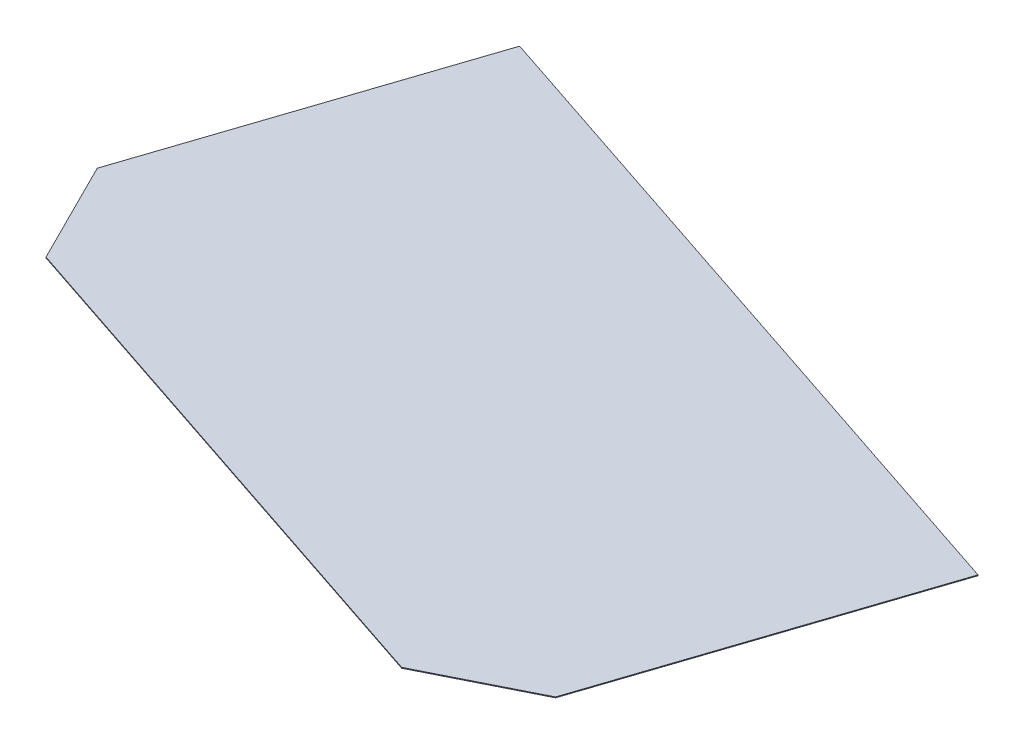
ISO-10303-21;
HEADER;
FILE_DESCRIPTION(('STEP AP214'),'2;1');
FILE_NAME('part.step','',(''),(''),'','','');
FILE_SCHEMA(('AUTOMOTIVE_DESIGN { 1 0 10303 214 1 1 1 1 }'));
ENDSEC;
DATA;
#1=APPLICATION_CONTEXT('core data for automotive mechanical design processes');
#2=APPLICATION_PROTOCOL_DEFINITION('international standard','automotive_design',2000,#1);
#3=PRODUCT_CONTEXT('',#1,'mechanical');
#4=PRODUCT('Part','Part','',(#3));
#5=PRODUCT_RELATED_PRODUCT_CATEGORY('part','',(#4));
#6=PRODUCT_DEFINITION_FORMATION('','',#4);
#7=PRODUCT_DEFINITION_CONTEXT('part definition',#1,'design');
#8=PRODUCT_DEFINITION('design','',#6,#7);
#9=PRODUCT_DEFINITION_SHAPE('','',#8);
#10=(LENGTH_UNIT() NAMED_UNIT(*) SI_UNIT(.MILLI.,.METRE.));
#11=(NAMED_UNIT(*) PLANE_ANGLE_UNIT() SI_UNIT($,.RADIAN.));
#12=(NAMED_UNIT(*) SI_UNIT($,.STERADIAN.) SOLID_ANGLE_UNIT());
#13=UNCERTAINTY_MEASURE_WITH_UNIT(LENGTH_MEASURE(1.E-05),#10,'distance_accuracy_value','');
#14=(GEOMETRIC_REPRESENTATION_CONTEXT(3) GLOBAL_UNCERTAINTY_ASSIGNED_CONTEXT((#13)) GLOBAL_UNIT_ASSIGNED_CONTEXT((#10,
#11,#12)) REPRESENTATION_CONTEXT('',''));
#15=CARTESIAN_POINT('',(0.,0.,0.));
#16=DIRECTION('',(0.,0.,1.));
#17=DIRECTION('',(1.,0.,0.));
#18=AXIS2_PLACEMENT_3D('',#15,#16,#17);
#19=CARTESIAN_POINT('',(98.2255983568584,0.0381,69.4198057224647));
#20=DIRECTION('',(-0.948811430440758,0.,-0.315843108940123));
#21=DIRECTION('',(-0.315843108940123,0.,0.948811430440758));
#22=AXIS2_PLACEMENT_3D('',#19,#20,#21);
#23=PLANE('',#22);
#24=DIRECTION('',(0.315843108940123,0.,-0.948811430440758));
#25=VECTOR('',#24,1.);
#26=CARTESIAN_POINT('',(98.2255983568584,-0.0381,69.4198057224647));
#27=LINE('',#26,#25);
#28=CARTESIAN_POINT('',(98.2255983568584,-0.0381,69.4198057224647));
#29=VERTEX_POINT('',#28);
#30=CARTESIAN_POINT('',(108.264082638208,-0.0381,39.2636036055148));
#31=VERTEX_POINT('',#30);
#32=EDGE_CURVE('E116',#29,#31,#27,.T.);
#33=ORIENTED_EDGE('',*,*,#32,.T.);
#34=DIRECTION('',(0.,-1.,0.));
#35=VECTOR('',#34,1.);
#36=CARTESIAN_POINT('',(108.264082638208,0.0381,39.2636036055148));
#37=LINE('',#36,#35);
#38=CARTESIAN_POINT('',(108.264082638208,0.0381,39.2636036055148));
#39=VERTEX_POINT('',#38);
#40=EDGE_CURVE('E11',#39,#31,#37,.T.);
#41=ORIENTED_EDGE('',*,*,#40,.F.);
#42=DIRECTION('',(0.315843108940123,0.,-0.948811430440758));
#43=VECTOR('',#42,1.);
#44=CARTESIAN_POINT('',(98.2255983568584,0.0381,69.4198057224647));
#45=LINE('',#44,#43);
#46=CARTESIAN_POINT('',(98.2255983568584,0.0381,69.4198057224647));
#47=VERTEX_POINT('',#46);
#48=EDGE_CURVE('E126',#47,#39,#45,.T.);
#49=ORIENTED_EDGE('',*,*,#48,.F.);
#50=DIRECTION('',(0.,-1.,0.));
#51=VECTOR('',#50,1.);
#52=CARTESIAN_POINT('',(98.2255983568584,0.0381,69.4198057224647));
#53=LINE('',#52,#51);
#54=EDGE_CURVE('E112',#47,#29,#53,.T.);
#55=ORIENTED_EDGE('',*,*,#54,.T.);
#56=EDGE_LOOP('',(#33,#41,#49,#55));
#57=FACE_BOUND('',#56,.T.);
#58=ADVANCED_FACE('F32',(#57),#23,.F.);
#59=CARTESIAN_POINT('',(108.264082638208,0.0381,39.2636036055148));
#60=DIRECTION('',(-0.315843108940123,0.,0.948811430440758));
#61=DIRECTION('',(0.948811430440758,0.,0.315843108940123));
#62=AXIS2_PLACEMENT_3D('',#59,#60,#61);
#63=PLANE('',#62);
#64=DIRECTION('',(-0.948811430440758,0.,-0.315843108940123));
#65=VECTOR('',#64,1.);
#66=CARTESIAN_POINT('',(108.264082638208,-0.0381,39.2636036055148));
#67=LINE('',#66,#65);
#68=CARTESIAN_POINT('',(42.8909750808395,-0.0381,17.5020133995403));
#69=VERTEX_POINT('',#68);
#70=EDGE_CURVE('E119',#31,#69,#67,.T.);
#71=ORIENTED_EDGE('',*,*,#70,.T.);
#72=DIRECTION('',(0.,-1.,0.));
#73=VECTOR('',#72,1.);
#74=CARTESIAN_POINT('',(42.8909750808395,0.0381,17.5020133995403));
#75=LINE('',#74,#73);
#76=CARTESIAN_POINT('',(42.8909750808395,0.0381,17.5020133995403));
#77=VERTEX_POINT('',#76);
#78=EDGE_CURVE('E40',#77,#69,#75,.T.);
#79=ORIENTED_EDGE('',*,*,#78,.F.);
#80=DIRECTION('',(-0.948811430440758,0.,-0.315843108940123));
#81=VECTOR('',#80,1.);
#82=CARTESIAN_POINT('',(108.264082638208,0.0381,39.2636036055148));
#83=LINE('',#82,#81);
#84=EDGE_CURVE('E85',#39,#77,#83,.T.);
#85=ORIENTED_EDGE('',*,*,#84,.F.);
#86=ORIENTED_EDGE('',*,*,#40,.T.);
#87=EDGE_LOOP('',(#71,#79,#85,#86));
#88=FACE_BOUND('',#87,.T.);
#89=ADVANCED_FACE('F150',(#88),#63,.F.);
#90=CARTESIAN_POINT('',(42.8909750808395,0.0381,17.5020133995403));
#91=DIRECTION('',(0.948811430440758,0.,0.315843108940123));
#92=DIRECTION('',(0.315843108940123,0.,-0.948811430440758));
#93=AXIS2_PLACEMENT_3D('',#90,#91,#92);
#94=PLANE('',#93);
#95=DIRECTION('',(-0.315843108940123,0.,0.948811430440758));
#96=VECTOR('',#95,1.);
#97=CARTESIAN_POINT('',(42.8909750808395,-0.0381,17.5020133995403));
#98=LINE('',#97,#96);
#99=CARTESIAN_POINT('',(32.8524907994901,-0.0381,47.6582155164902));
#100=VERTEX_POINT('',#99);
#101=EDGE_CURVE('E121',#69,#100,#98,.T.);
#102=ORIENTED_EDGE('',*,*,#101,.T.);
#103=DIRECTION('',(0.,-1.,0.));
#104=VECTOR('',#103,1.);
#105=CARTESIAN_POINT('',(32.8524907994901,0.0381,47.6582155164902));
#106=LINE('',#105,#104);
#107=CARTESIAN_POINT('',(32.8524907994901,0.0381,47.6582155164902));
#108=VERTEX_POINT('',#107);
#109=EDGE_CURVE('E107',#108,#100,#106,.T.);
#110=ORIENTED_EDGE('',*,*,#109,.F.);
#111=DIRECTION('',(-0.315843108940123,0.,0.948811430440758));
#112=VECTOR('',#111,1.);
#113=CARTESIAN_POINT('',(42.8909750808395,0.0381,17.5020133995403));
#114=LINE('',#113,#112);
#115=EDGE_CURVE('E98',#77,#108,#114,.T.);
#116=ORIENTED_EDGE('',*,*,#115,.F.);
#117=ORIENTED_EDGE('',*,*,#78,.T.);
#118=EDGE_LOOP('',(#102,#110,#116,#117));
#119=FACE_BOUND('',#118,.T.);
#120=ADVANCED_FACE('F132',(#119),#94,.F.);
#121=CARTESIAN_POINT('',(32.8524907994901,0.0381,47.6582155164902));
#122=DIRECTION('',(0.894245800654571,0.,-0.447576192409366));
#123=DIRECTION('',(-0.447576192409366,0.,-0.894245800654571));
#124=AXIS2_PLACEMENT_3D('',#121,#122,#123);
#125=PLANE('',#124);
#126=DIRECTION('',(0.447576192409366,0.,0.894245800654571));
#127=VECTOR('',#126,1.);
#128=CARTESIAN_POINT('',(32.8524907994901,-0.0381,47.6582155164902));
#129=LINE('',#128,#127);
#130=CARTESIAN_POINT('',(37.7370216631647,-0.0381,57.4173834237357));
#131=VERTEX_POINT('',#130);
#132=EDGE_CURVE('E106',#100,#131,#129,.T.);
#133=ORIENTED_EDGE('',*,*,#132,.T.);
#134=DIRECTION('',(0.,-1.,0.));
#135=VECTOR('',#134,1.);
#136=CARTESIAN_POINT('',(37.7370216631647,0.0381,57.4173834237357));
#137=LINE('',#136,#135);
#138=CARTESIAN_POINT('',(37.7370216631647,0.0381,57.4173834237357));
#139=VERTEX_POINT('',#138);
#140=EDGE_CURVE('E103',#139,#131,#137,.T.);
#141=ORIENTED_EDGE('',*,*,#140,.F.);
#142=DIRECTION('',(0.447576192409366,0.,0.894245800654571));
#143=VECTOR('',#142,1.);
#144=CARTESIAN_POINT('',(32.8524907994901,0.0381,47.6582155164902));
#145=LINE('',#144,#143);
#146=EDGE_CURVE('E92',#108,#139,#145,.T.);
#147=ORIENTED_EDGE('',*,*,#146,.F.);
#148=ORIENTED_EDGE('',*,*,#109,.T.);
#149=EDGE_LOOP('',(#133,#141,#147,#148));
#150=FACE_BOUND('',#149,.T.);
#151=ADVANCED_FACE('F104',(#150),#125,.F.);
#152=CARTESIAN_POINT('',(37.7370216631647,0.0381,57.4173834237357));
#153=DIRECTION('',(0.315843108940123,0.,-0.948811430440758));
#154=DIRECTION('',(-0.948811430440758,0.,-0.315843108940123));
#155=AXIS2_PLACEMENT_3D('',#152,#153,#154);
#156=PLANE('',#155);
#157=DIRECTION('',(0.948811430440758,0.,0.315843108940123));
#158=VECTOR('',#157,1.);
#159=CARTESIAN_POINT('',(37.7370216631647,-0.0381,57.4173834237357));
#160=LINE('',#159,#158);
#161=CARTESIAN_POINT('',(88.4664304496129,-0.0381,74.3043365861393));
#162=VERTEX_POINT('',#161);
#163=EDGE_CURVE('E71',#131,#162,#160,.T.);
#164=ORIENTED_EDGE('',*,*,#163,.T.);
#165=DIRECTION('',(0.,-1.,0.));
#166=VECTOR('',#165,1.);
#167=CARTESIAN_POINT('',(88.4664304496129,0.0381,74.3043365861393));
#168=LINE('',#167,#166);
#169=CARTESIAN_POINT('',(88.4664304496129,0.0381,74.3043365861393));
#170=VERTEX_POINT('',#169);
#171=EDGE_CURVE('E108',#170,#162,#168,.T.);
#172=ORIENTED_EDGE('',*,*,#171,.F.);
#173=DIRECTION('',(0.948811430440758,0.,0.315843108940123));
#174=VECTOR('',#173,1.);
#175=CARTESIAN_POINT('',(37.7370216631647,0.0381,57.4173834237357));
#176=LINE('',#175,#174);
#177=EDGE_CURVE('E96',#139,#170,#176,.T.);
#178=ORIENTED_EDGE('',*,*,#177,.F.);
#179=ORIENTED_EDGE('',*,*,#140,.T.);
#180=EDGE_LOOP('',(#164,#172,#178,#179));
#181=FACE_BOUND('',#180,.T.);
#182=ADVANCED_FACE('F110',(#181),#156,.F.);
#183=CARTESIAN_POINT('',(88.4664304496129,0.0381,74.3043365861393));
#184=DIRECTION('',(-0.447576192409372,0.,-0.894245800654568));
#185=DIRECTION('',(-0.894245800654568,0.,0.447576192409372));
#186=AXIS2_PLACEMENT_3D('',#183,#184,#185);
#187=PLANE('',#186);
#188=DIRECTION('',(0.894245800654568,0.,-0.447576192409372));
#189=VECTOR('',#188,1.);
#190=CARTESIAN_POINT('',(88.4664304496129,-0.0381,74.3043365861393));
#191=LINE('',#190,#189);
#192=EDGE_CURVE('E77',#162,#29,#191,.T.);
#193=ORIENTED_EDGE('',*,*,#192,.T.);
#194=ORIENTED_EDGE('',*,*,#54,.F.);
#195=DIRECTION('',(0.894245800654568,0.,-0.447576192409372));
#196=VECTOR('',#195,1.);
#197=CARTESIAN_POINT('',(88.4664304496129,0.0381,74.3043365861393));
#198=LINE('',#197,#196);
#199=EDGE_CURVE('E48',#170,#47,#198,.T.);
#200=ORIENTED_EDGE('',*,*,#199,.F.);
#201=ORIENTED_EDGE('',*,*,#171,.T.);
#202=EDGE_LOOP('',(#193,#194,#200,#201));
#203=FACE_BOUND('',#202,.T.);
#204=ADVANCED_FACE('F139',(#203),#187,.F.);
#205=CARTESIAN_POINT('',(108.264082638208,0.0381,39.2636036055148));
#206=DIRECTION('',(0.,1.,0.));
#207=DIRECTION('',(0.,0.,1.));
#208=AXIS2_PLACEMENT_3D('',#205,#206,#207);
#209=PLANE('',#208);
#210=ORIENTED_EDGE('',*,*,#48,.T.);
#211=ORIENTED_EDGE('',*,*,#84,.T.);
#212=ORIENTED_EDGE('',*,*,#115,.T.);
#213=ORIENTED_EDGE('',*,*,#146,.T.);
#214=ORIENTED_EDGE('',*,*,#177,.T.);
#215=ORIENTED_EDGE('',*,*,#199,.T.);
#216=EDGE_LOOP('',(#210,#211,#212,#213,#214,#215));
#217=FACE_BOUND('',#216,.T.);
#218=ADVANCED_FACE('F94',(#217),#209,.T.);
#219=CARTESIAN_POINT('',(108.264082638208,-0.0381,39.2636036055148));
#220=DIRECTION('',(0.,1.,0.));
#221=DIRECTION('',(0.,0.,1.));
#222=AXIS2_PLACEMENT_3D('',#219,#220,#221);
#223=PLANE('',#222);
#224=ORIENTED_EDGE('',*,*,#32,.F.);
#225=ORIENTED_EDGE('',*,*,#192,.F.);
#226=ORIENTED_EDGE('',*,*,#163,.F.);
#227=ORIENTED_EDGE('',*,*,#132,.F.);
#228=ORIENTED_EDGE('',*,*,#101,.F.);
#229=ORIENTED_EDGE('',*,*,#70,.F.);
#230=EDGE_LOOP('',(#224,#225,#226,#227,#228,#229));
#231=FACE_BOUND('',#230,.T.);
#232=ADVANCED_FACE('F135',(#231),#223,.F.);
#233=CLOSED_SHELL('',(#58,#89,#120,#151,#182,#204,#218,#232));
#234=MANIFOLD_SOLID_BREP('B2',#233);
#235=ADVANCED_BREP_SHAPE_REPRESENTATION('',(#18,#234),#14);
#236=SHAPE_DEFINITION_REPRESENTATION(#9,#235);
ENDSEC;
END-ISO-10303-21;
